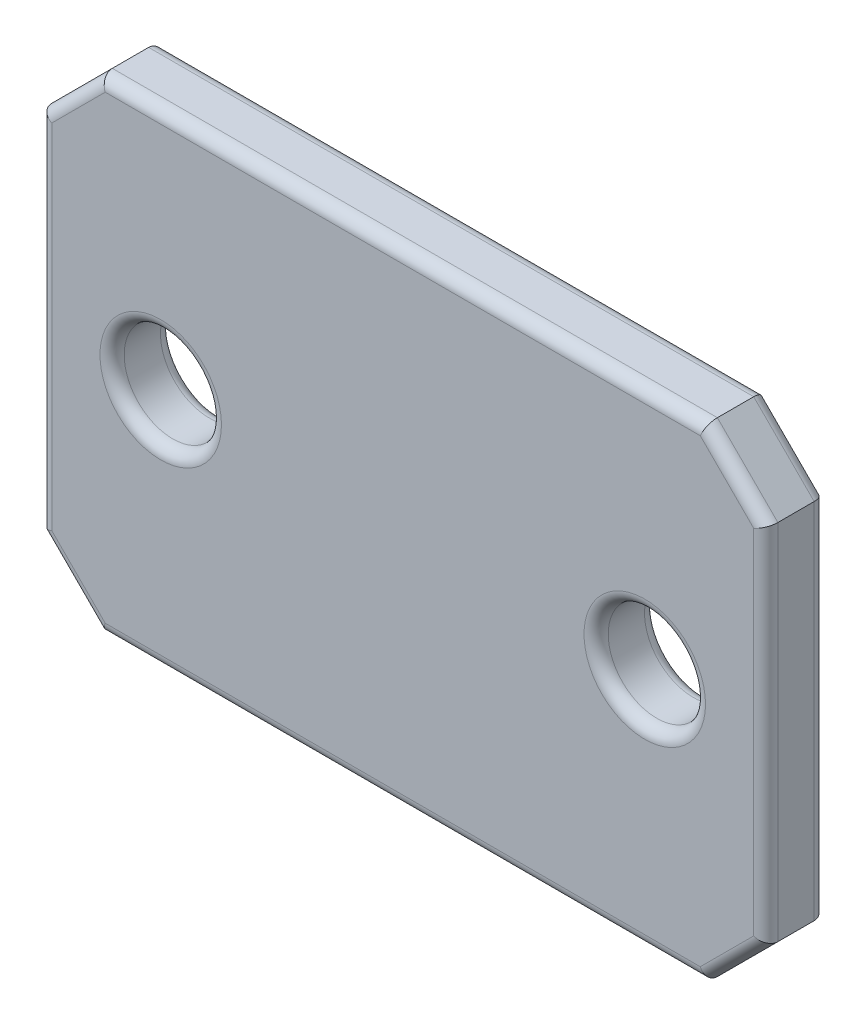
ISO-10303-21;
HEADER;
FILE_DESCRIPTION(('STEP AP214'),'2;1');
FILE_NAME('part.step','',(''),(''),'','','');
FILE_SCHEMA(('AUTOMOTIVE_DESIGN { 1 0 10303 214 1 1 1 1 }'));
ENDSEC;
DATA;
#1=APPLICATION_CONTEXT('core data for automotive mechanical design processes');
#2=APPLICATION_PROTOCOL_DEFINITION('international standard','automotive_design',2000,#1);
#3=PRODUCT_CONTEXT('',#1,'mechanical');
#4=PRODUCT('Part','Part','',(#3));
#5=PRODUCT_RELATED_PRODUCT_CATEGORY('part','',(#4));
#6=PRODUCT_DEFINITION_FORMATION('','',#4);
#7=PRODUCT_DEFINITION_CONTEXT('part definition',#1,'design');
#8=PRODUCT_DEFINITION('design','',#6,#7);
#9=PRODUCT_DEFINITION_SHAPE('','',#8);
#10=(LENGTH_UNIT() NAMED_UNIT(*) SI_UNIT(.MILLI.,.METRE.));
#11=(NAMED_UNIT(*) PLANE_ANGLE_UNIT() SI_UNIT($,.RADIAN.));
#12=(NAMED_UNIT(*) SI_UNIT($,.STERADIAN.) SOLID_ANGLE_UNIT());
#13=UNCERTAINTY_MEASURE_WITH_UNIT(LENGTH_MEASURE(1.E-05),#10,'distance_accuracy_value','');
#14=(GEOMETRIC_REPRESENTATION_CONTEXT(3) GLOBAL_UNCERTAINTY_ASSIGNED_CONTEXT((#13)) GLOBAL_UNIT_ASSIGNED_CONTEXT((#10,
#11,#12)) REPRESENTATION_CONTEXT('',''));
#15=CARTESIAN_POINT('',(0.,0.,0.));
#16=DIRECTION('',(0.,0.,1.));
#17=DIRECTION('',(1.,0.,0.));
#18=AXIS2_PLACEMENT_3D('',#15,#16,#17);
#19=CARTESIAN_POINT('',(-15.875,12.7,3.175));
#20=DIRECTION('',(0.707106781186546,-0.707106781186549,0.));
#21=DIRECTION('',(0.707106781186549,0.707106781186546,0.));
#22=AXIS2_PLACEMENT_3D('',#19,#20,#21);
#23=PLANE('',#22);
#24=DIRECTION('',(0.,0.,-1.));
#25=VECTOR('',#24,1.);
#26=CARTESIAN_POINT('',(-15.875,12.7,3.175));
#27=LINE('',#26,#25);
#28=CARTESIAN_POINT('',(-15.875,12.7,2.54));
#29=VERTEX_POINT('',#28);
#30=CARTESIAN_POINT('',(-15.875,12.7,0.635));
#31=VERTEX_POINT('',#30);
#32=EDGE_CURVE('E293',#29,#31,#27,.T.);
#33=ORIENTED_EDGE('',*,*,#32,.T.);
#34=DIRECTION('',(-0.707106781186549,-0.707106781186546,0.));
#35=VECTOR('',#34,1.);
#36=CARTESIAN_POINT('',(-15.875,12.7,0.635));
#37=LINE('',#36,#35);
#38=CARTESIAN_POINT('',(-19.05,9.52499999999999,0.635));
#39=VERTEX_POINT('',#38);
#40=EDGE_CURVE('E240',#31,#39,#37,.T.);
#41=ORIENTED_EDGE('',*,*,#40,.T.);
#42=DIRECTION('',(0.,0.,-1.));
#43=VECTOR('',#42,1.);
#44=CARTESIAN_POINT('',(-19.05,9.52499999999999,3.175));
#45=LINE('',#44,#43);
#46=CARTESIAN_POINT('',(-19.05,9.52499999999999,2.54));
#47=VERTEX_POINT('',#46);
#48=EDGE_CURVE('E173',#47,#39,#45,.T.);
#49=ORIENTED_EDGE('',*,*,#48,.F.);
#50=DIRECTION('',(-0.707106781186549,-0.707106781186546,0.));
#51=VECTOR('',#50,1.);
#52=CARTESIAN_POINT('',(-15.875,12.7,2.54));
#53=LINE('',#52,#51);
#54=EDGE_CURVE('E238',#47,#29,#53,.F.);
#55=ORIENTED_EDGE('',*,*,#54,.T.);
#56=EDGE_LOOP('',(#33,#41,#49,#55));
#57=FACE_BOUND('',#56,.T.);
#58=ADVANCED_FACE('F37',(#57),#23,.F.);
#59=CARTESIAN_POINT('',(-19.05,9.52499999999999,3.175));
#60=DIRECTION('',(1.,0.,0.));
#61=DIRECTION('',(0.,0.,-1.));
#62=AXIS2_PLACEMENT_3D('',#59,#60,#61);
#63=PLANE('',#62);
#64=ORIENTED_EDGE('',*,*,#48,.T.);
#65=DIRECTION('',(0.,-1.,0.));
#66=VECTOR('',#65,1.);
#67=CARTESIAN_POINT('',(-19.05,9.52499999999999,0.635));
#68=LINE('',#67,#66);
#69=CARTESIAN_POINT('',(-19.05,-9.52499999999998,0.635));
#70=VERTEX_POINT('',#69);
#71=EDGE_CURVE('E172',#39,#70,#68,.T.);
#72=ORIENTED_EDGE('',*,*,#71,.T.);
#73=DIRECTION('',(0.,0.,-1.));
#74=VECTOR('',#73,1.);
#75=CARTESIAN_POINT('',(-19.05,-9.52499999999998,3.175));
#76=LINE('',#75,#74);
#77=CARTESIAN_POINT('',(-19.05,-9.52499999999998,2.54));
#78=VERTEX_POINT('',#77);
#79=EDGE_CURVE('E154',#78,#70,#76,.T.);
#80=ORIENTED_EDGE('',*,*,#79,.F.);
#81=DIRECTION('',(0.,-1.,0.));
#82=VECTOR('',#81,1.);
#83=CARTESIAN_POINT('',(-19.05,9.52499999999999,2.54));
#84=LINE('',#83,#82);
#85=EDGE_CURVE('E169',#78,#47,#84,.F.);
#86=ORIENTED_EDGE('',*,*,#85,.T.);
#87=EDGE_LOOP('',(#64,#72,#80,#86));
#88=FACE_BOUND('',#87,.T.);
#89=ADVANCED_FACE('F167',(#88),#63,.F.);
#90=CARTESIAN_POINT('',(-19.05,-9.52499999999998,3.175));
#91=DIRECTION('',(0.707106781186549,0.707106781186546,0.));
#92=DIRECTION('',(-0.707106781186546,0.707106781186549,0.));
#93=AXIS2_PLACEMENT_3D('',#90,#91,#92);
#94=PLANE('',#93);
#95=ORIENTED_EDGE('',*,*,#79,.T.);
#96=DIRECTION('',(0.707106781186546,-0.707106781186549,0.));
#97=VECTOR('',#96,1.);
#98=CARTESIAN_POINT('',(-19.05,-9.52499999999998,0.635));
#99=LINE('',#98,#97);
#100=CARTESIAN_POINT('',(-15.875,-12.7,0.635));
#101=VERTEX_POINT('',#100);
#102=EDGE_CURVE('E161',#70,#101,#99,.T.);
#103=ORIENTED_EDGE('',*,*,#102,.T.);
#104=DIRECTION('',(0.,0.,-1.));
#105=VECTOR('',#104,1.);
#106=CARTESIAN_POINT('',(-15.875,-12.7,3.175));
#107=LINE('',#106,#105);
#108=CARTESIAN_POINT('',(-15.875,-12.7,2.54));
#109=VERTEX_POINT('',#108);
#110=EDGE_CURVE('E156',#109,#101,#107,.T.);
#111=ORIENTED_EDGE('',*,*,#110,.F.);
#112=DIRECTION('',(0.707106781186546,-0.707106781186549,0.));
#113=VECTOR('',#112,1.);
#114=CARTESIAN_POINT('',(-19.05,-9.52499999999998,2.54));
#115=LINE('',#114,#113);
#116=EDGE_CURVE('E151',#109,#78,#115,.F.);
#117=ORIENTED_EDGE('',*,*,#116,.T.);
#118=EDGE_LOOP('',(#95,#103,#111,#117));
#119=FACE_BOUND('',#118,.T.);
#120=ADVANCED_FACE('F153',(#119),#94,.F.);
#121=CARTESIAN_POINT('',(-15.875,-12.7,3.175));
#122=DIRECTION('',(0.,1.,0.));
#123=DIRECTION('',(0.,0.,1.));
#124=AXIS2_PLACEMENT_3D('',#121,#122,#123);
#125=PLANE('',#124);
#126=ORIENTED_EDGE('',*,*,#110,.T.);
#127=DIRECTION('',(1.,0.,0.));
#128=VECTOR('',#127,1.);
#129=CARTESIAN_POINT('',(-15.875,-12.7,0.635));
#130=LINE('',#129,#128);
#131=CARTESIAN_POINT('',(15.875,-12.7,0.635));
#132=VERTEX_POINT('',#131);
#133=EDGE_CURVE('E219',#101,#132,#130,.T.);
#134=ORIENTED_EDGE('',*,*,#133,.T.);
#135=DIRECTION('',(0.,0.,-1.));
#136=VECTOR('',#135,1.);
#137=CARTESIAN_POINT('',(15.875,-12.7,3.175));
#138=LINE('',#137,#136);
#139=CARTESIAN_POINT('',(15.875,-12.7,2.54));
#140=VERTEX_POINT('',#139);
#141=EDGE_CURVE('E319',#140,#132,#138,.T.);
#142=ORIENTED_EDGE('',*,*,#141,.F.);
#143=DIRECTION('',(1.,0.,0.));
#144=VECTOR('',#143,1.);
#145=CARTESIAN_POINT('',(-15.875,-12.7,2.54));
#146=LINE('',#145,#144);
#147=EDGE_CURVE('E217',#140,#109,#146,.F.);
#148=ORIENTED_EDGE('',*,*,#147,.T.);
#149=EDGE_LOOP('',(#126,#134,#142,#148));
#150=FACE_BOUND('',#149,.T.);
#151=ADVANCED_FACE('F316',(#150),#125,.F.);
#152=CARTESIAN_POINT('',(15.875,-12.7,3.175));
#153=DIRECTION('',(-0.707106781186547,0.707106781186548,0.));
#154=DIRECTION('',(-0.707106781186548,-0.707106781186547,0.));
#155=AXIS2_PLACEMENT_3D('',#152,#153,#154);
#156=PLANE('',#155);
#157=ORIENTED_EDGE('',*,*,#141,.T.);
#158=DIRECTION('',(0.707106781186548,0.707106781186547,0.));
#159=VECTOR('',#158,1.);
#160=CARTESIAN_POINT('',(15.875,-12.7,0.635));
#161=LINE('',#160,#159);
#162=CARTESIAN_POINT('',(19.05,-9.52500000000002,0.635));
#163=VERTEX_POINT('',#162);
#164=EDGE_CURVE('E223',#132,#163,#161,.T.);
#165=ORIENTED_EDGE('',*,*,#164,.T.);
#166=DIRECTION('',(0.,0.,-1.));
#167=VECTOR('',#166,1.);
#168=CARTESIAN_POINT('',(19.05,-9.52500000000002,3.175));
#169=LINE('',#168,#167);
#170=CARTESIAN_POINT('',(19.05,-9.52500000000002,2.54));
#171=VERTEX_POINT('',#170);
#172=EDGE_CURVE('E322',#171,#163,#169,.T.);
#173=ORIENTED_EDGE('',*,*,#172,.F.);
#174=DIRECTION('',(0.707106781186548,0.707106781186547,0.));
#175=VECTOR('',#174,1.);
#176=CARTESIAN_POINT('',(15.875,-12.7,2.54));
#177=LINE('',#176,#175);
#178=EDGE_CURVE('E221',#171,#140,#177,.F.);
#179=ORIENTED_EDGE('',*,*,#178,.T.);
#180=EDGE_LOOP('',(#157,#165,#173,#179));
#181=FACE_BOUND('',#180,.T.);
#182=ADVANCED_FACE('F367',(#181),#156,.F.);
#183=CARTESIAN_POINT('',(19.05,-9.52500000000002,3.175));
#184=DIRECTION('',(-1.,0.,0.));
#185=DIRECTION('',(0.,-1.,0.));
#186=AXIS2_PLACEMENT_3D('',#183,#184,#185);
#187=PLANE('',#186);
#188=ORIENTED_EDGE('',*,*,#172,.T.);
#189=DIRECTION('',(0.,1.,0.));
#190=VECTOR('',#189,1.);
#191=CARTESIAN_POINT('',(19.05,-9.52500000000002,0.635));
#192=LINE('',#191,#190);
#193=CARTESIAN_POINT('',(19.05,9.52499999999998,0.635));
#194=VERTEX_POINT('',#193);
#195=EDGE_CURVE('E227',#163,#194,#192,.T.);
#196=ORIENTED_EDGE('',*,*,#195,.T.);
#197=DIRECTION('',(0.,0.,-1.));
#198=VECTOR('',#197,1.);
#199=CARTESIAN_POINT('',(19.05,9.52499999999998,3.175));
#200=LINE('',#199,#198);
#201=CARTESIAN_POINT('',(19.05,9.52499999999998,2.54));
#202=VERTEX_POINT('',#201);
#203=EDGE_CURVE('E326',#202,#194,#200,.T.);
#204=ORIENTED_EDGE('',*,*,#203,.F.);
#205=DIRECTION('',(0.,1.,0.));
#206=VECTOR('',#205,1.);
#207=CARTESIAN_POINT('',(19.05,-9.52500000000002,2.54));
#208=LINE('',#207,#206);
#209=EDGE_CURVE('E225',#202,#171,#208,.F.);
#210=ORIENTED_EDGE('',*,*,#209,.T.);
#211=EDGE_LOOP('',(#188,#196,#204,#210));
#212=FACE_BOUND('',#211,.T.);
#213=ADVANCED_FACE('F370',(#212),#187,.F.);
#214=CARTESIAN_POINT('',(19.05,9.52499999999998,3.175));
#215=DIRECTION('',(-0.707106781186548,-0.707106781186548,0.));
#216=DIRECTION('',(0.707106781186548,-0.707106781186548,0.));
#217=AXIS2_PLACEMENT_3D('',#214,#215,#216);
#218=PLANE('',#217);
#219=ORIENTED_EDGE('',*,*,#203,.T.);
#220=DIRECTION('',(-0.707106781186548,0.707106781186548,0.));
#221=VECTOR('',#220,1.);
#222=CARTESIAN_POINT('',(19.05,9.52499999999998,0.635));
#223=LINE('',#222,#221);
#224=CARTESIAN_POINT('',(15.875,12.7,0.635));
#225=VERTEX_POINT('',#224);
#226=EDGE_CURVE('E231',#194,#225,#223,.T.);
#227=ORIENTED_EDGE('',*,*,#226,.T.);
#228=DIRECTION('',(0.,0.,-1.));
#229=VECTOR('',#228,1.);
#230=CARTESIAN_POINT('',(15.875,12.7,3.175));
#231=LINE('',#230,#229);
#232=CARTESIAN_POINT('',(15.875,12.7,2.54));
#233=VERTEX_POINT('',#232);
#234=EDGE_CURVE('E331',#233,#225,#231,.T.);
#235=ORIENTED_EDGE('',*,*,#234,.F.);
#236=DIRECTION('',(-0.707106781186548,0.707106781186548,0.));
#237=VECTOR('',#236,1.);
#238=CARTESIAN_POINT('',(19.05,9.52499999999998,2.54));
#239=LINE('',#238,#237);
#240=EDGE_CURVE('E229',#233,#202,#239,.F.);
#241=ORIENTED_EDGE('',*,*,#240,.T.);
#242=EDGE_LOOP('',(#219,#227,#235,#241));
#243=FACE_BOUND('',#242,.T.);
#244=ADVANCED_FACE('F384',(#243),#218,.F.);
#245=CARTESIAN_POINT('',(15.875,12.7,3.175));
#246=DIRECTION('',(0.,-1.,0.));
#247=DIRECTION('',(0.,0.,-1.));
#248=AXIS2_PLACEMENT_3D('',#245,#246,#247);
#249=PLANE('',#248);
#250=ORIENTED_EDGE('',*,*,#234,.T.);
#251=DIRECTION('',(-1.,0.,0.));
#252=VECTOR('',#251,1.);
#253=CARTESIAN_POINT('',(15.875,12.7,0.635));
#254=LINE('',#253,#252);
#255=EDGE_CURVE('E236',#225,#31,#254,.T.);
#256=ORIENTED_EDGE('',*,*,#255,.T.);
#257=ORIENTED_EDGE('',*,*,#32,.F.);
#258=DIRECTION('',(-1.,0.,0.));
#259=VECTOR('',#258,1.);
#260=CARTESIAN_POINT('',(15.875,12.7,2.54));
#261=LINE('',#260,#259);
#262=EDGE_CURVE('E233',#29,#233,#261,.F.);
#263=ORIENTED_EDGE('',*,*,#262,.T.);
#264=EDGE_LOOP('',(#250,#256,#257,#263));
#265=FACE_BOUND('',#264,.T.);
#266=ADVANCED_FACE('F385',(#265),#249,.F.);
#267=CARTESIAN_POINT('',(0.,0.,3.175));
#268=DIRECTION('',(0.,0.,1.));
#269=DIRECTION('',(1.,0.,0.));
#270=AXIS2_PLACEMENT_3D('',#267,#268,#269);
#271=PLANE('',#270);
#272=DIRECTION('',(-0.707106781186548,0.707106781186548,0.));
#273=VECTOR('',#272,1.);
#274=CARTESIAN_POINT('',(15.4259871939465,12.2509871939465,3.175));
#275=LINE('',#274,#273);
#276=CARTESIAN_POINT('',(18.415,9.26197438789307,3.175));
#277=VERTEX_POINT('',#276);
#278=CARTESIAN_POINT('',(15.6119743878931,12.065,3.175));
#279=VERTEX_POINT('',#278);
#280=EDGE_CURVE('E46',#277,#279,#275,.T.);
#281=ORIENTED_EDGE('',*,*,#280,.T.);
#282=DIRECTION('',(-1.,0.,0.));
#283=VECTOR('',#282,1.);
#284=CARTESIAN_POINT('',(-15.875,12.065,3.175));
#285=LINE('',#284,#283);
#286=CARTESIAN_POINT('',(-15.6119743878931,12.065,3.175));
#287=VERTEX_POINT('',#286);
#288=EDGE_CURVE('E11',#279,#287,#285,.T.);
#289=ORIENTED_EDGE('',*,*,#288,.T.);
#290=DIRECTION('',(-0.707106781186549,-0.707106781186546,0.));
#291=VECTOR('',#290,1.);
#292=CARTESIAN_POINT('',(-18.6009871939465,9.07598719394653,3.175));
#293=LINE('',#292,#291);
#294=CARTESIAN_POINT('',(-18.415,9.26197438789308,3.175));
#295=VERTEX_POINT('',#294);
#296=EDGE_CURVE('E260',#287,#295,#293,.T.);
#297=ORIENTED_EDGE('',*,*,#296,.T.);
#298=DIRECTION('',(0.,-1.,0.));
#299=VECTOR('',#298,1.);
#300=CARTESIAN_POINT('',(-18.415,-9.52499999999998,3.175));
#301=LINE('',#300,#299);
#302=CARTESIAN_POINT('',(-18.415,-9.26197438789307,3.175));
#303=VERTEX_POINT('',#302);
#304=EDGE_CURVE('E262',#295,#303,#301,.T.);
#305=ORIENTED_EDGE('',*,*,#304,.T.);
#306=DIRECTION('',(0.707106781186546,-0.707106781186549,0.));
#307=VECTOR('',#306,1.);
#308=CARTESIAN_POINT('',(-15.4259871939465,-12.2509871939465,3.175));
#309=LINE('',#308,#307);
#310=CARTESIAN_POINT('',(-15.6119743878931,-12.065,3.175));
#311=VERTEX_POINT('',#310);
#312=EDGE_CURVE('E179',#303,#311,#309,.T.);
#313=ORIENTED_EDGE('',*,*,#312,.T.);
#314=DIRECTION('',(1.,0.,0.));
#315=VECTOR('',#314,1.);
#316=CARTESIAN_POINT('',(15.875,-12.065,3.175));
#317=LINE('',#316,#315);
#318=CARTESIAN_POINT('',(15.6119743878931,-12.065,3.175));
#319=VERTEX_POINT('',#318);
#320=EDGE_CURVE('E265',#311,#319,#317,.T.);
#321=ORIENTED_EDGE('',*,*,#320,.T.);
#322=DIRECTION('',(0.707106781186548,0.707106781186547,0.));
#323=VECTOR('',#322,1.);
#324=CARTESIAN_POINT('',(18.6009871939465,-9.07598719394656,3.175));
#325=LINE('',#324,#323);
#326=CARTESIAN_POINT('',(18.415,-9.26197438789311,3.175));
#327=VERTEX_POINT('',#326);
#328=EDGE_CURVE('E267',#319,#327,#325,.T.);
#329=ORIENTED_EDGE('',*,*,#328,.T.);
#330=DIRECTION('',(0.,1.,0.));
#331=VECTOR('',#330,1.);
#332=CARTESIAN_POINT('',(18.415,9.52499999999998,3.175));
#333=LINE('',#332,#331);
#334=EDGE_CURVE('E57',#327,#277,#333,.T.);
#335=ORIENTED_EDGE('',*,*,#334,.T.);
#336=EDGE_LOOP('',(#281,#289,#297,#305,#313,#321,#329,#335));
#337=FACE_BOUND('',#336,.T.);
#338=CARTESIAN_POINT('',(-12.7,-2.07299455379228E-13,3.175));
#339=DIRECTION('',(0.,0.,1.));
#340=DIRECTION('',(1.,0.,0.));
#341=AXIS2_PLACEMENT_3D('',#338,#339,#340);
#342=CIRCLE('',#341,3.18769999999999);
#343=CARTESIAN_POINT('',(-9.51230000000003,-2.07299455379228E-13,3.175));
#344=VERTEX_POINT('',#343);
#345=EDGE_CURVE('E257',#344,#344,#342,.F.);
#346=ORIENTED_EDGE('',*,*,#345,.T.);
#347=EDGE_LOOP('',(#346));
#348=FACE_BOUND('',#347,.T.);
#349=CARTESIAN_POINT('',(12.7,-2.03830008427275E-13,3.175));
#350=DIRECTION('',(0.,0.,1.));
#351=DIRECTION('',(1.,0.,0.));
#352=AXIS2_PLACEMENT_3D('',#349,#350,#351);
#353=CIRCLE('',#352,3.18769999999999);
#354=CARTESIAN_POINT('',(15.8877,-2.03830008427275E-13,3.175));
#355=VERTEX_POINT('',#354);
#356=EDGE_CURVE('E254',#355,#355,#353,.F.);
#357=ORIENTED_EDGE('',*,*,#356,.T.);
#358=EDGE_LOOP('',(#357));
#359=FACE_BOUND('',#358,.T.);
#360=ADVANCED_FACE('F394',(#337,#348,#359),#271,.T.);
#361=CARTESIAN_POINT('',(0.,0.,0.));
#362=DIRECTION('',(0.,0.,1.));
#363=DIRECTION('',(1.,0.,0.));
#364=AXIS2_PLACEMENT_3D('',#361,#362,#363);
#365=PLANE('',#364);
#366=DIRECTION('',(0.707106781186546,-0.707106781186549,0.));
#367=VECTOR('',#366,1.);
#368=CARTESIAN_POINT('',(-13.8384871939466,-13.8384871939465,0.));
#369=LINE('',#368,#367);
#370=CARTESIAN_POINT('',(-15.6119743878931,-12.065,0.));
#371=VERTEX_POINT('',#370);
#372=CARTESIAN_POINT('',(-18.415,-9.26197438789307,0.));
#373=VERTEX_POINT('',#372);
#374=EDGE_CURVE('E212',#371,#373,#369,.F.);
#375=ORIENTED_EDGE('',*,*,#374,.T.);
#376=DIRECTION('',(0.,-1.,0.));
#377=VECTOR('',#376,1.);
#378=CARTESIAN_POINT('',(-18.415,0.,0.));
#379=LINE('',#378,#377);
#380=CARTESIAN_POINT('',(-18.415,9.26197438789307,0.));
#381=VERTEX_POINT('',#380);
#382=EDGE_CURVE('E162',#373,#381,#379,.F.);
#383=ORIENTED_EDGE('',*,*,#382,.T.);
#384=DIRECTION('',(-0.707106781186549,-0.707106781186546,0.));
#385=VECTOR('',#384,1.);
#386=CARTESIAN_POINT('',(-13.8384871939465,13.8384871939466,0.));
#387=LINE('',#386,#385);
#388=CARTESIAN_POINT('',(-15.6119743878931,12.065,0.));
#389=VERTEX_POINT('',#388);
#390=EDGE_CURVE('E200',#381,#389,#387,.F.);
#391=ORIENTED_EDGE('',*,*,#390,.T.);
#392=DIRECTION('',(-1.,0.,0.));
#393=VECTOR('',#392,1.);
#394=CARTESIAN_POINT('',(0.,12.065,0.));
#395=LINE('',#394,#393);
#396=CARTESIAN_POINT('',(15.6119743878931,12.065,0.));
#397=VERTEX_POINT('',#396);
#398=EDGE_CURVE('E202',#389,#397,#395,.F.);
#399=ORIENTED_EDGE('',*,*,#398,.T.);
#400=DIRECTION('',(-0.707106781186548,0.707106781186548,0.));
#401=VECTOR('',#400,1.);
#402=CARTESIAN_POINT('',(13.8384871939465,13.8384871939465,0.));
#403=LINE('',#402,#401);
#404=CARTESIAN_POINT('',(18.415,9.26197438789307,0.));
#405=VERTEX_POINT('',#404);
#406=EDGE_CURVE('E204',#397,#405,#403,.F.);
#407=ORIENTED_EDGE('',*,*,#406,.T.);
#408=DIRECTION('',(0.,1.,0.));
#409=VECTOR('',#408,1.);
#410=CARTESIAN_POINT('',(18.415,0.,0.));
#411=LINE('',#410,#409);
#412=CARTESIAN_POINT('',(18.415,-9.2619743878931,0.));
#413=VERTEX_POINT('',#412);
#414=EDGE_CURVE('E206',#405,#413,#411,.F.);
#415=ORIENTED_EDGE('',*,*,#414,.T.);
#416=DIRECTION('',(0.707106781186548,0.707106781186547,0.));
#417=VECTOR('',#416,1.);
#418=CARTESIAN_POINT('',(13.8384871939465,-13.8384871939466,0.));
#419=LINE('',#418,#417);
#420=CARTESIAN_POINT('',(15.6119743878931,-12.065,0.));
#421=VERTEX_POINT('',#420);
#422=EDGE_CURVE('E208',#413,#421,#419,.F.);
#423=ORIENTED_EDGE('',*,*,#422,.T.);
#424=DIRECTION('',(1.,0.,0.));
#425=VECTOR('',#424,1.);
#426=CARTESIAN_POINT('',(0.,-12.065,0.));
#427=LINE('',#426,#425);
#428=EDGE_CURVE('E210',#421,#371,#427,.F.);
#429=ORIENTED_EDGE('',*,*,#428,.T.);
#430=EDGE_LOOP('',(#375,#383,#391,#399,#407,#415,#423,#429));
#431=FACE_BOUND('',#430,.T.);
#432=CARTESIAN_POINT('',(-12.7,-2.07299455379228E-13,0.));
#433=DIRECTION('',(0.,0.,1.));
#434=DIRECTION('',(1.,0.,0.));
#435=AXIS2_PLACEMENT_3D('',#432,#433,#434);
#436=CIRCLE('',#435,3.18769999999999);
#437=CARTESIAN_POINT('',(-9.51230000000003,-2.07299455379228E-13,0.));
#438=VERTEX_POINT('',#437);
#439=EDGE_CURVE('E197',#438,#438,#436,.T.);
#440=ORIENTED_EDGE('',*,*,#439,.T.);
#441=EDGE_LOOP('',(#440));
#442=FACE_BOUND('',#441,.T.);
#443=CARTESIAN_POINT('',(12.7,-2.03830008427275E-13,0.));
#444=DIRECTION('',(0.,0.,1.));
#445=DIRECTION('',(1.,0.,0.));
#446=AXIS2_PLACEMENT_3D('',#443,#444,#445);
#447=CIRCLE('',#446,3.18769999999999);
#448=CARTESIAN_POINT('',(15.8877,-2.03830008427275E-13,0.));
#449=VERTEX_POINT('',#448);
#450=EDGE_CURVE('E191',#449,#449,#447,.T.);
#451=ORIENTED_EDGE('',*,*,#450,.T.);
#452=EDGE_LOOP('',(#451));
#453=FACE_BOUND('',#452,.T.);
#454=ADVANCED_FACE('F397',(#431,#442,#453),#365,.F.);
#455=CARTESIAN_POINT('',(-12.7,-2.07299455379228E-13,3.175));
#456=DIRECTION('',(0.,0.,1.));
#457=DIRECTION('',(1.,0.,0.));
#458=AXIS2_PLACEMENT_3D('',#455,#456,#457);
#459=CYLINDRICAL_SURFACE('',#458,2.55269999999999);
#460=CARTESIAN_POINT('',(-12.7,-2.07299455379228E-13,0.635));
#461=DIRECTION('',(0.,0.,1.));
#462=DIRECTION('',(1.,0.,0.));
#463=AXIS2_PLACEMENT_3D('',#460,#461,#462);
#464=CIRCLE('',#463,2.55269999999999);
#465=CARTESIAN_POINT('',(-10.1473,-2.07299455379228E-13,0.635));
#466=VERTEX_POINT('',#465);
#467=EDGE_CURVE('E245',#466,#466,#464,.F.);
#468=ORIENTED_EDGE('',*,*,#467,.T.);
#469=EDGE_LOOP('',(#468));
#470=FACE_BOUND('',#469,.T.);
#471=CARTESIAN_POINT('',(-12.7,-2.07299455379228E-13,2.54));
#472=DIRECTION('',(0.,0.,1.));
#473=DIRECTION('',(1.,0.,0.));
#474=AXIS2_PLACEMENT_3D('',#471,#472,#473);
#475=CIRCLE('',#474,2.55269999999999);
#476=CARTESIAN_POINT('',(-10.1473,-2.07299455379228E-13,2.54));
#477=VERTEX_POINT('',#476);
#478=EDGE_CURVE('E242',#477,#477,#475,.T.);
#479=ORIENTED_EDGE('',*,*,#478,.T.);
#480=EDGE_LOOP('',(#479));
#481=FACE_BOUND('',#480,.T.);
#482=ADVANCED_FACE('F410',(#470,#481),#459,.F.);
#483=CARTESIAN_POINT('',(12.7,-2.03830008427275E-13,3.175));
#484=DIRECTION('',(0.,0.,1.));
#485=DIRECTION('',(1.,0.,0.));
#486=AXIS2_PLACEMENT_3D('',#483,#484,#485);
#487=CYLINDRICAL_SURFACE('',#486,2.55269999999999);
#488=CARTESIAN_POINT('',(12.7,-2.03830008427275E-13,0.635));
#489=DIRECTION('',(0.,0.,1.));
#490=DIRECTION('',(1.,0.,0.));
#491=AXIS2_PLACEMENT_3D('',#488,#489,#490);
#492=CIRCLE('',#491,2.55269999999999);
#493=CARTESIAN_POINT('',(15.2527,-2.03830008427275E-13,0.635));
#494=VERTEX_POINT('',#493);
#495=EDGE_CURVE('E251',#494,#494,#492,.F.);
#496=ORIENTED_EDGE('',*,*,#495,.T.);
#497=EDGE_LOOP('',(#496));
#498=FACE_BOUND('',#497,.T.);
#499=CARTESIAN_POINT('',(12.7,-2.03830008427275E-13,2.54));
#500=DIRECTION('',(0.,0.,1.));
#501=DIRECTION('',(1.,0.,0.));
#502=AXIS2_PLACEMENT_3D('',#499,#500,#501);
#503=CIRCLE('',#502,2.55269999999999);
#504=CARTESIAN_POINT('',(15.2527,-2.03830008427275E-13,2.54));
#505=VERTEX_POINT('',#504);
#506=EDGE_CURVE('E248',#505,#505,#503,.T.);
#507=ORIENTED_EDGE('',*,*,#506,.T.);
#508=EDGE_LOOP('',(#507));
#509=FACE_BOUND('',#508,.T.);
#510=ADVANCED_FACE('F408',(#498,#509),#487,.F.);
#511=CARTESIAN_POINT('',(18.415,-9.52500000000002,0.635));
#512=DIRECTION('',(0.,1.,0.));
#513=DIRECTION('',(-1.,0.,0.));
#514=AXIS2_PLACEMENT_3D('',#511,#512,#513);
#515=CYLINDRICAL_SURFACE('',#514,0.635);
#516=CARTESIAN_POINT('',(18.415,-9.2619743878931,0.635));
#517=DIRECTION('',(0.38268343236509,0.923879532511287,0.));
#518=DIRECTION('',(-0.923879532511287,0.38268343236509,0.));
#519=AXIS2_PLACEMENT_3D('',#516,#517,#518);
#520=ELLIPSE('',#519,0.68731904718567,0.635);
#521=EDGE_CURVE('E287',#413,#163,#520,.F.);
#522=ORIENTED_EDGE('',*,*,#521,.F.);
#523=ORIENTED_EDGE('',*,*,#414,.F.);
#524=CARTESIAN_POINT('',(18.415,9.26197438789307,0.635));
#525=DIRECTION('',(-0.38268343236509,0.923879532511287,0.));
#526=DIRECTION('',(-0.923879532511287,-0.38268343236509,0.));
#527=AXIS2_PLACEMENT_3D('',#524,#525,#526);
#528=ELLIPSE('',#527,0.68731904718567,0.635);
#529=EDGE_CURVE('E290',#194,#405,#528,.T.);
#530=ORIENTED_EDGE('',*,*,#529,.F.);
#531=ORIENTED_EDGE('',*,*,#195,.F.);
#532=EDGE_LOOP('',(#522,#523,#530,#531));
#533=FACE_BOUND('',#532,.T.);
#534=ADVANCED_FACE('F375',(#533),#515,.T.);
#535=CARTESIAN_POINT('',(18.6009871939465,9.07598719394653,0.635));
#536=DIRECTION('',(-0.707106781186548,0.707106781186548,0.));
#537=DIRECTION('',(-0.707106781186548,-0.707106781186548,0.));
#538=AXIS2_PLACEMENT_3D('',#535,#536,#537);
#539=CYLINDRICAL_SURFACE('',#538,0.635);
#540=ORIENTED_EDGE('',*,*,#529,.T.);
#541=ORIENTED_EDGE('',*,*,#406,.F.);
#542=CARTESIAN_POINT('',(15.6119743878931,12.065,0.635));
#543=DIRECTION('',(-0.923879532511287,0.38268343236509,0.));
#544=DIRECTION('',(-0.38268343236509,-0.923879532511287,0.));
#545=AXIS2_PLACEMENT_3D('',#542,#543,#544);
#546=ELLIPSE('',#545,0.68731904718567,0.635);
#547=EDGE_CURVE('E284',#225,#397,#546,.T.);
#548=ORIENTED_EDGE('',*,*,#547,.F.);
#549=ORIENTED_EDGE('',*,*,#226,.F.);
#550=EDGE_LOOP('',(#540,#541,#548,#549));
#551=FACE_BOUND('',#550,.T.);
#552=ADVANCED_FACE('F381',(#551),#539,.T.);
#553=CARTESIAN_POINT('',(15.4259871939466,-12.2509871939465,0.635));
#554=DIRECTION('',(0.707106781186548,0.707106781186547,0.));
#555=DIRECTION('',(-0.707106781186547,0.707106781186548,0.));
#556=AXIS2_PLACEMENT_3D('',#553,#554,#555);
#557=CYLINDRICAL_SURFACE('',#556,0.635);
#558=ORIENTED_EDGE('',*,*,#521,.T.);
#559=ORIENTED_EDGE('',*,*,#164,.F.);
#560=CARTESIAN_POINT('',(15.6119743878931,-12.065,0.635));
#561=DIRECTION('',(0.923879532511287,0.382683432365089,0.));
#562=DIRECTION('',(-0.382683432365089,0.923879532511287,0.));
#563=AXIS2_PLACEMENT_3D('',#560,#561,#562);
#564=ELLIPSE('',#563,0.68731904718567,0.635);
#565=EDGE_CURVE('E281',#421,#132,#564,.F.);
#566=ORIENTED_EDGE('',*,*,#565,.F.);
#567=ORIENTED_EDGE('',*,*,#422,.F.);
#568=EDGE_LOOP('',(#558,#559,#566,#567));
#569=FACE_BOUND('',#568,.T.);
#570=ADVANCED_FACE('F364',(#569),#557,.T.);
#571=CARTESIAN_POINT('',(15.875,12.065,0.635));
#572=DIRECTION('',(-1.,0.,0.));
#573=DIRECTION('',(0.,0.,1.));
#574=AXIS2_PLACEMENT_3D('',#571,#572,#573);
#575=CYLINDRICAL_SURFACE('',#574,0.635);
#576=ORIENTED_EDGE('',*,*,#547,.T.);
#577=ORIENTED_EDGE('',*,*,#398,.F.);
#578=CARTESIAN_POINT('',(-15.6119743878931,12.065,0.635));
#579=DIRECTION('',(-0.923879532511287,-0.382683432365089,0.));
#580=DIRECTION('',(0.382683432365089,-0.923879532511287,0.));
#581=AXIS2_PLACEMENT_3D('',#578,#579,#580);
#582=ELLIPSE('',#581,0.68731904718567,0.635);
#583=EDGE_CURVE('E278',#31,#389,#582,.T.);
#584=ORIENTED_EDGE('',*,*,#583,.F.);
#585=ORIENTED_EDGE('',*,*,#255,.F.);
#586=EDGE_LOOP('',(#576,#577,#584,#585));
#587=FACE_BOUND('',#586,.T.);
#588=ADVANCED_FACE('F344',(#587),#575,.T.);
#589=CARTESIAN_POINT('',(-15.875,-12.065,0.635));
#590=DIRECTION('',(1.,0.,0.));
#591=DIRECTION('',(0.,0.,-1.));
#592=AXIS2_PLACEMENT_3D('',#589,#590,#591);
#593=CYLINDRICAL_SURFACE('',#592,0.635);
#594=ORIENTED_EDGE('',*,*,#565,.T.);
#595=ORIENTED_EDGE('',*,*,#133,.F.);
#596=CARTESIAN_POINT('',(-15.6119743878931,-12.065,0.635));
#597=DIRECTION('',(0.923879532511286,-0.382683432365091,0.));
#598=DIRECTION('',(0.382683432365091,0.923879532511286,0.));
#599=AXIS2_PLACEMENT_3D('',#596,#597,#598);
#600=ELLIPSE('',#599,0.68731904718567,0.635);
#601=EDGE_CURVE('E275',#371,#101,#600,.F.);
#602=ORIENTED_EDGE('',*,*,#601,.F.);
#603=ORIENTED_EDGE('',*,*,#428,.F.);
#604=EDGE_LOOP('',(#594,#595,#602,#603));
#605=FACE_BOUND('',#604,.T.);
#606=ADVANCED_FACE('F360',(#605),#593,.T.);
#607=CARTESIAN_POINT('',(-15.4259871939465,12.2509871939465,0.635));
#608=DIRECTION('',(-0.707106781186549,-0.707106781186546,0.));
#609=DIRECTION('',(0.707106781186546,-0.707106781186549,0.));
#610=AXIS2_PLACEMENT_3D('',#607,#608,#609);
#611=CYLINDRICAL_SURFACE('',#610,0.635);
#612=ORIENTED_EDGE('',*,*,#583,.T.);
#613=ORIENTED_EDGE('',*,*,#390,.F.);
#614=CARTESIAN_POINT('',(-18.415,9.26197438789308,0.635));
#615=DIRECTION('',(-0.382683432365091,-0.923879532511286,0.));
#616=DIRECTION('',(-0.923879532511286,0.382683432365091,0.));
#617=AXIS2_PLACEMENT_3D('',#614,#615,#616);
#618=ELLIPSE('',#617,0.68731904718567,0.635);
#619=EDGE_CURVE('E273',#39,#381,#618,.T.);
#620=ORIENTED_EDGE('',*,*,#619,.F.);
#621=ORIENTED_EDGE('',*,*,#40,.F.);
#622=EDGE_LOOP('',(#612,#613,#620,#621));
#623=FACE_BOUND('',#622,.T.);
#624=ADVANCED_FACE('F348',(#623),#611,.T.);
#625=CARTESIAN_POINT('',(-18.6009871939465,-9.07598719394653,0.635));
#626=DIRECTION('',(0.707106781186546,-0.707106781186549,0.));
#627=DIRECTION('',(0.707106781186549,0.707106781186546,0.));
#628=AXIS2_PLACEMENT_3D('',#625,#626,#627);
#629=CYLINDRICAL_SURFACE('',#628,0.635);
#630=ORIENTED_EDGE('',*,*,#601,.T.);
#631=ORIENTED_EDGE('',*,*,#102,.F.);
#632=CARTESIAN_POINT('',(-18.415,-9.26197438789307,0.635));
#633=DIRECTION('',(0.382683432365089,-0.923879532511287,0.));
#634=DIRECTION('',(0.923879532511287,0.382683432365089,0.));
#635=AXIS2_PLACEMENT_3D('',#632,#633,#634);
#636=ELLIPSE('',#635,0.68731904718567,0.635);
#637=EDGE_CURVE('E271',#373,#70,#636,.F.);
#638=ORIENTED_EDGE('',*,*,#637,.F.);
#639=ORIENTED_EDGE('',*,*,#374,.F.);
#640=EDGE_LOOP('',(#630,#631,#638,#639));
#641=FACE_BOUND('',#640,.T.);
#642=ADVANCED_FACE('F356',(#641),#629,.T.);
#643=CARTESIAN_POINT('',(-18.415,9.52499999999999,0.635));
#644=DIRECTION('',(0.,-1.,0.));
#645=DIRECTION('',(0.,0.,-1.));
#646=AXIS2_PLACEMENT_3D('',#643,#644,#645);
#647=CYLINDRICAL_SURFACE('',#646,0.635);
#648=ORIENTED_EDGE('',*,*,#619,.T.);
#649=ORIENTED_EDGE('',*,*,#382,.F.);
#650=ORIENTED_EDGE('',*,*,#637,.T.);
#651=ORIENTED_EDGE('',*,*,#71,.F.);
#652=EDGE_LOOP('',(#648,#649,#650,#651));
#653=FACE_BOUND('',#652,.T.);
#654=ADVANCED_FACE('F351',(#653),#647,.T.);
#655=CARTESIAN_POINT('',(-12.7,-2.07299455379228E-13,0.635));
#656=DIRECTION('',(0.,0.,1.));
#657=DIRECTION('',(1.,0.,0.));
#658=AXIS2_PLACEMENT_3D('',#655,#656,#657);
#659=TOROIDAL_SURFACE('',#658,3.18769999999999,0.635);
#660=ORIENTED_EDGE('',*,*,#467,.F.);
#661=EDGE_LOOP('',(#660));
#662=FACE_BOUND('',#661,.T.);
#663=ORIENTED_EDGE('',*,*,#439,.F.);
#664=EDGE_LOOP('',(#663));
#665=FACE_BOUND('',#664,.T.);
#666=ADVANCED_FACE('F430',(#662,#665),#659,.T.);
#667=CARTESIAN_POINT('',(12.7,-2.03830008427275E-13,0.635));
#668=DIRECTION('',(0.,0.,1.));
#669=DIRECTION('',(1.,0.,0.));
#670=AXIS2_PLACEMENT_3D('',#667,#668,#669);
#671=TOROIDAL_SURFACE('',#670,3.18769999999999,0.635);
#672=ORIENTED_EDGE('',*,*,#495,.F.);
#673=EDGE_LOOP('',(#672));
#674=FACE_BOUND('',#673,.T.);
#675=ORIENTED_EDGE('',*,*,#450,.F.);
#676=EDGE_LOOP('',(#675));
#677=FACE_BOUND('',#676,.T.);
#678=ADVANCED_FACE('F445',(#674,#677),#671,.T.);
#679=CARTESIAN_POINT('',(0.,-12.065,2.54));
#680=DIRECTION('',(-1.,0.,0.));
#681=DIRECTION('',(0.,0.,1.));
#682=AXIS2_PLACEMENT_3D('',#679,#680,#681);
#683=CYLINDRICAL_SURFACE('',#682,0.635);
#684=CARTESIAN_POINT('',(-15.6119743878931,-12.065,2.54));
#685=DIRECTION('',(-0.923879532511286,0.382683432365091,0.));
#686=DIRECTION('',(0.382683432365091,0.923879532511286,0.));
#687=AXIS2_PLACEMENT_3D('',#684,#685,#686);
#688=ELLIPSE('',#687,0.68731904718567,0.635);
#689=EDGE_CURVE('E302',#109,#311,#688,.T.);
#690=ORIENTED_EDGE('',*,*,#689,.F.);
#691=ORIENTED_EDGE('',*,*,#147,.F.);
#692=CARTESIAN_POINT('',(15.6119743878931,-12.065,2.54));
#693=DIRECTION('',(-0.923879532511287,-0.382683432365089,0.));
#694=DIRECTION('',(-0.382683432365089,0.923879532511287,0.));
#695=AXIS2_PLACEMENT_3D('',#692,#693,#694);
#696=ELLIPSE('',#695,0.68731904718567,0.635);
#697=EDGE_CURVE('E41',#319,#140,#696,.F.);
#698=ORIENTED_EDGE('',*,*,#697,.F.);
#699=ORIENTED_EDGE('',*,*,#320,.F.);
#700=EDGE_LOOP('',(#690,#691,#698,#699));
#701=FACE_BOUND('',#700,.T.);
#702=ADVANCED_FACE('F313',(#701),#683,.T.);
#703=CARTESIAN_POINT('',(13.8384871939465,-13.8384871939466,2.54));
#704=DIRECTION('',(-0.707106781186548,-0.707106781186547,0.));
#705=DIRECTION('',(0.707106781186547,-0.707106781186548,0.));
#706=AXIS2_PLACEMENT_3D('',#703,#704,#705);
#707=CYLINDRICAL_SURFACE('',#706,0.635);
#708=ORIENTED_EDGE('',*,*,#697,.T.);
#709=ORIENTED_EDGE('',*,*,#178,.F.);
#710=CARTESIAN_POINT('',(18.415,-9.2619743878931,2.54));
#711=DIRECTION('',(-0.38268343236509,-0.923879532511287,0.));
#712=DIRECTION('',(-0.923879532511287,0.38268343236509,0.));
#713=AXIS2_PLACEMENT_3D('',#710,#711,#712);
#714=ELLIPSE('',#713,0.68731904718567,0.635);
#715=EDGE_CURVE('E182',#327,#171,#714,.F.);
#716=ORIENTED_EDGE('',*,*,#715,.F.);
#717=ORIENTED_EDGE('',*,*,#328,.F.);
#718=EDGE_LOOP('',(#708,#709,#716,#717));
#719=FACE_BOUND('',#718,.T.);
#720=ADVANCED_FACE('F308',(#719),#707,.T.);
#721=CARTESIAN_POINT('',(-13.8384871939466,-13.8384871939465,2.54));
#722=DIRECTION('',(-0.707106781186546,0.707106781186549,0.));
#723=DIRECTION('',(-0.707106781186549,-0.707106781186546,0.));
#724=AXIS2_PLACEMENT_3D('',#721,#722,#723);
#725=CYLINDRICAL_SURFACE('',#724,0.635);
#726=ORIENTED_EDGE('',*,*,#689,.T.);
#727=ORIENTED_EDGE('',*,*,#312,.F.);
#728=CARTESIAN_POINT('',(-18.415,-9.26197438789307,2.54));
#729=DIRECTION('',(-0.382683432365089,0.923879532511287,0.));
#730=DIRECTION('',(0.923879532511287,0.382683432365089,0.));
#731=AXIS2_PLACEMENT_3D('',#728,#729,#730);
#732=ELLIPSE('',#731,0.68731904718567,0.635);
#733=EDGE_CURVE('E177',#78,#303,#732,.T.);
#734=ORIENTED_EDGE('',*,*,#733,.F.);
#735=ORIENTED_EDGE('',*,*,#116,.F.);
#736=EDGE_LOOP('',(#726,#727,#734,#735));
#737=FACE_BOUND('',#736,.T.);
#738=ADVANCED_FACE('F178',(#737),#725,.T.);
#739=CARTESIAN_POINT('',(18.415,0.,2.54));
#740=DIRECTION('',(0.,-1.,0.));
#741=DIRECTION('',(1.,0.,0.));
#742=AXIS2_PLACEMENT_3D('',#739,#740,#741);
#743=CYLINDRICAL_SURFACE('',#742,0.635);
#744=ORIENTED_EDGE('',*,*,#715,.T.);
#745=ORIENTED_EDGE('',*,*,#209,.F.);
#746=CARTESIAN_POINT('',(18.415,9.26197438789306,2.54));
#747=DIRECTION('',(0.38268343236509,-0.923879532511287,0.));
#748=DIRECTION('',(-0.923879532511287,-0.38268343236509,0.));
#749=AXIS2_PLACEMENT_3D('',#746,#747,#748);
#750=ELLIPSE('',#749,0.68731904718567,0.635);
#751=EDGE_CURVE('E183',#277,#202,#750,.F.);
#752=ORIENTED_EDGE('',*,*,#751,.F.);
#753=ORIENTED_EDGE('',*,*,#334,.F.);
#754=EDGE_LOOP('',(#744,#745,#752,#753));
#755=FACE_BOUND('',#754,.T.);
#756=ADVANCED_FACE('F460',(#755),#743,.T.);
#757=CARTESIAN_POINT('',(-18.415,0.,2.54));
#758=DIRECTION('',(0.,1.,0.));
#759=DIRECTION('',(0.,0.,1.));
#760=AXIS2_PLACEMENT_3D('',#757,#758,#759);
#761=CYLINDRICAL_SURFACE('',#760,0.635);
#762=ORIENTED_EDGE('',*,*,#733,.T.);
#763=ORIENTED_EDGE('',*,*,#304,.F.);
#764=CARTESIAN_POINT('',(-18.415,9.26197438789308,2.54));
#765=DIRECTION('',(0.382683432365091,0.923879532511286,0.));
#766=DIRECTION('',(0.923879532511286,-0.382683432365091,0.));
#767=AXIS2_PLACEMENT_3D('',#764,#765,#766);
#768=ELLIPSE('',#767,0.68731904718567,0.635);
#769=EDGE_CURVE('E188',#47,#295,#768,.T.);
#770=ORIENTED_EDGE('',*,*,#769,.F.);
#771=ORIENTED_EDGE('',*,*,#85,.F.);
#772=EDGE_LOOP('',(#762,#763,#770,#771));
#773=FACE_BOUND('',#772,.T.);
#774=ADVANCED_FACE('F186',(#773),#761,.T.);
#775=CARTESIAN_POINT('',(13.8384871939465,13.8384871939465,2.54));
#776=DIRECTION('',(0.707106781186548,-0.707106781186548,0.));
#777=DIRECTION('',(0.707106781186548,0.707106781186548,0.));
#778=AXIS2_PLACEMENT_3D('',#775,#776,#777);
#779=CYLINDRICAL_SURFACE('',#778,0.635);
#780=ORIENTED_EDGE('',*,*,#751,.T.);
#781=ORIENTED_EDGE('',*,*,#240,.F.);
#782=CARTESIAN_POINT('',(15.6119743878931,12.065,2.54));
#783=DIRECTION('',(0.923879532511287,-0.38268343236509,0.));
#784=DIRECTION('',(-0.38268343236509,-0.923879532511287,0.));
#785=AXIS2_PLACEMENT_3D('',#782,#783,#784);
#786=ELLIPSE('',#785,0.68731904718567,0.635);
#787=EDGE_CURVE('E296',#279,#233,#786,.F.);
#788=ORIENTED_EDGE('',*,*,#787,.F.);
#789=ORIENTED_EDGE('',*,*,#280,.F.);
#790=EDGE_LOOP('',(#780,#781,#788,#789));
#791=FACE_BOUND('',#790,.T.);
#792=ADVANCED_FACE('F454',(#791),#779,.T.);
#793=CARTESIAN_POINT('',(-13.8384871939465,13.8384871939466,2.54));
#794=DIRECTION('',(0.707106781186549,0.707106781186546,0.));
#795=DIRECTION('',(-0.707106781186546,0.707106781186549,0.));
#796=AXIS2_PLACEMENT_3D('',#793,#794,#795);
#797=CYLINDRICAL_SURFACE('',#796,0.635);
#798=ORIENTED_EDGE('',*,*,#769,.T.);
#799=ORIENTED_EDGE('',*,*,#296,.F.);
#800=CARTESIAN_POINT('',(-15.6119743878931,12.065,2.54));
#801=DIRECTION('',(0.923879532511287,0.382683432365089,0.));
#802=DIRECTION('',(-0.382683432365089,0.923879532511287,0.));
#803=AXIS2_PLACEMENT_3D('',#800,#801,#802);
#804=ELLIPSE('',#803,0.68731904718567,0.635);
#805=EDGE_CURVE('E294',#29,#287,#804,.T.);
#806=ORIENTED_EDGE('',*,*,#805,.F.);
#807=ORIENTED_EDGE('',*,*,#54,.F.);
#808=EDGE_LOOP('',(#798,#799,#806,#807));
#809=FACE_BOUND('',#808,.T.);
#810=ADVANCED_FACE('F393',(#809),#797,.T.);
#811=CARTESIAN_POINT('',(0.,12.065,2.54));
#812=DIRECTION('',(1.,0.,0.));
#813=DIRECTION('',(0.,0.,-1.));
#814=AXIS2_PLACEMENT_3D('',#811,#812,#813);
#815=CYLINDRICAL_SURFACE('',#814,0.635);
#816=ORIENTED_EDGE('',*,*,#787,.T.);
#817=ORIENTED_EDGE('',*,*,#262,.F.);
#818=ORIENTED_EDGE('',*,*,#805,.T.);
#819=ORIENTED_EDGE('',*,*,#288,.F.);
#820=EDGE_LOOP('',(#816,#817,#818,#819));
#821=FACE_BOUND('',#820,.T.);
#822=ADVANCED_FACE('F388',(#821),#815,.T.);
#823=CARTESIAN_POINT('',(-12.7,-2.07299455379228E-13,2.54));
#824=DIRECTION('',(0.,0.,1.));
#825=DIRECTION('',(1.,0.,0.));
#826=AXIS2_PLACEMENT_3D('',#823,#824,#825);
#827=TOROIDAL_SURFACE('',#826,3.18769999999999,0.635);
#828=ORIENTED_EDGE('',*,*,#345,.F.);
#829=EDGE_LOOP('',(#828));
#830=FACE_BOUND('',#829,.T.);
#831=ORIENTED_EDGE('',*,*,#478,.F.);
#832=EDGE_LOOP('',(#831));
#833=FACE_BOUND('',#832,.T.);
#834=ADVANCED_FACE('F405',(#830,#833),#827,.T.);
#835=CARTESIAN_POINT('',(12.7,-2.03830008427275E-13,2.54));
#836=DIRECTION('',(0.,0.,1.));
#837=DIRECTION('',(1.,0.,0.));
#838=AXIS2_PLACEMENT_3D('',#835,#836,#837);
#839=TOROIDAL_SURFACE('',#838,3.18769999999999,0.635);
#840=ORIENTED_EDGE('',*,*,#356,.F.);
#841=EDGE_LOOP('',(#840));
#842=FACE_BOUND('',#841,.T.);
#843=ORIENTED_EDGE('',*,*,#506,.F.);
#844=EDGE_LOOP('',(#843));
#845=FACE_BOUND('',#844,.T.);
#846=ADVANCED_FACE('F39',(#842,#845),#839,.T.);
#847=CLOSED_SHELL('',(#58,#89,#120,#151,#182,#213,#244,#266,#360,#454,#482,#510,#534,#552,#570,
#588,#606,#624,#642,#654,#666,#678,#702,#720,#738,#756,#774,#792,#810,#822,#834,#846));
#848=MANIFOLD_SOLID_BREP('B2',#847);
#849=ADVANCED_BREP_SHAPE_REPRESENTATION('',(#18,#848),#14);
#850=SHAPE_DEFINITION_REPRESENTATION(#9,#849);
ENDSEC;
END-ISO-10303-21;
